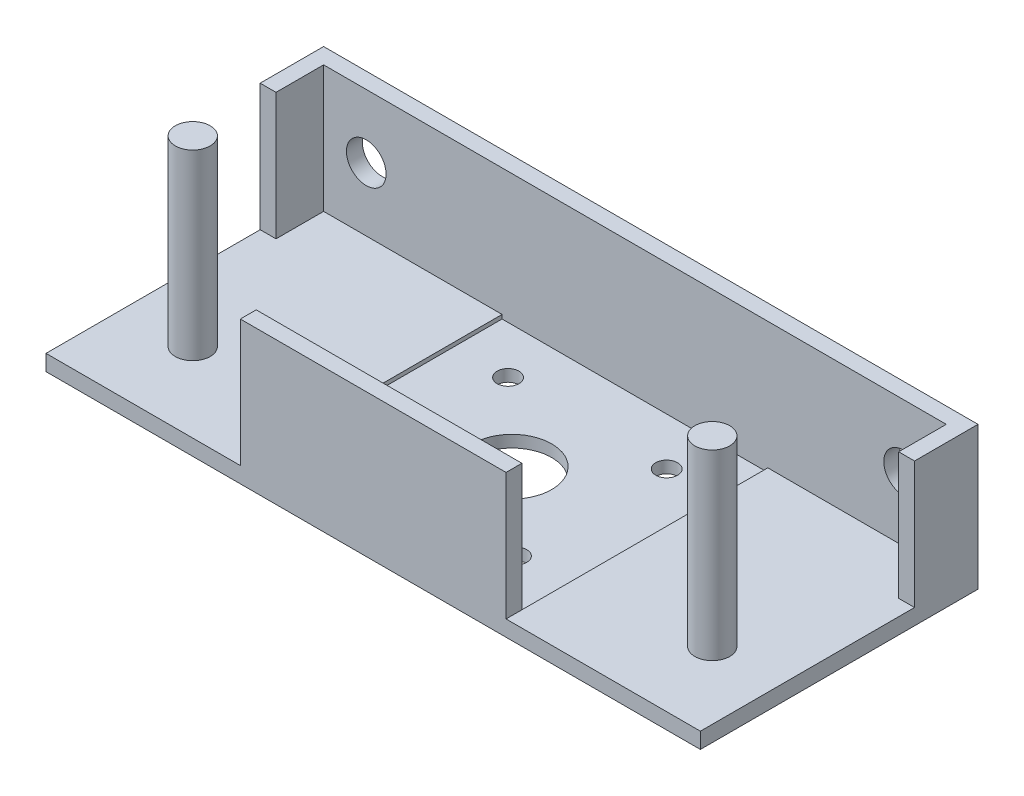
ISO-10303-21;
HEADER;
FILE_DESCRIPTION(('STEP AP214'),'2;1');
FILE_NAME('part.step','',(''),(''),'','','');
FILE_SCHEMA(('AUTOMOTIVE_DESIGN { 1 0 10303 214 1 1 1 1 }'));
ENDSEC;
DATA;
#1=APPLICATION_CONTEXT('core data for automotive mechanical design processes');
#2=APPLICATION_PROTOCOL_DEFINITION('international standard','automotive_design',2000,#1);
#3=PRODUCT_CONTEXT('',#1,'mechanical');
#4=PRODUCT('Part','Part','',(#3));
#5=PRODUCT_RELATED_PRODUCT_CATEGORY('part','',(#4));
#6=PRODUCT_DEFINITION_FORMATION('','',#4);
#7=PRODUCT_DEFINITION_CONTEXT('part definition',#1,'design');
#8=PRODUCT_DEFINITION('design','',#6,#7);
#9=PRODUCT_DEFINITION_SHAPE('','',#8);
#10=(LENGTH_UNIT() NAMED_UNIT(*) SI_UNIT(.MILLI.,.METRE.));
#11=(NAMED_UNIT(*) PLANE_ANGLE_UNIT() SI_UNIT($,.RADIAN.));
#12=(NAMED_UNIT(*) SI_UNIT($,.STERADIAN.) SOLID_ANGLE_UNIT());
#13=UNCERTAINTY_MEASURE_WITH_UNIT(LENGTH_MEASURE(1.E-05),#10,'distance_accuracy_value','');
#14=(GEOMETRIC_REPRESENTATION_CONTEXT(3) GLOBAL_UNCERTAINTY_ASSIGNED_CONTEXT((#13)) GLOBAL_UNIT_ASSIGNED_CONTEXT((#10,
#11,#12)) REPRESENTATION_CONTEXT('',''));
#15=CARTESIAN_POINT('',(0.,0.,0.));
#16=DIRECTION('',(0.,0.,1.));
#17=DIRECTION('',(1.,0.,0.));
#18=AXIS2_PLACEMENT_3D('',#15,#16,#17);
#19=CARTESIAN_POINT('',(-33.5,113.,31.));
#20=DIRECTION('',(0.,0.,-1.));
#21=DIRECTION('',(-1.,0.,0.));
#22=AXIS2_PLACEMENT_3D('',#19,#20,#21);
#23=PLANE('',#22);
#24=DIRECTION('',(0.,-1.,0.));
#25=VECTOR('',#24,1.);
#26=CARTESIAN_POINT('',(-33.5,113.,31.));
#27=LINE('',#26,#25);
#28=CARTESIAN_POINT('',(-33.5,84.,31.));
#29=VERTEX_POINT('',#28);
#30=CARTESIAN_POINT('',(-33.5,83.,31.));
#31=VERTEX_POINT('',#30);
#32=EDGE_CURVE('E214',#29,#31,#27,.T.);
#33=ORIENTED_EDGE('',*,*,#32,.F.);
#34=DIRECTION('',(0.,1.,0.));
#35=VECTOR('',#34,1.);
#36=CARTESIAN_POINT('',(-33.5,113.,31.));
#37=LINE('',#36,#35);
#38=CARTESIAN_POINT('',(-33.5,116.,31.));
#39=VERTEX_POINT('',#38);
#40=EDGE_CURVE('E357',#29,#39,#37,.T.);
#41=ORIENTED_EDGE('',*,*,#40,.T.);
#42=DIRECTION('',(1.,0.,0.));
#43=VECTOR('',#42,1.);
#44=CARTESIAN_POINT('',(-78.5,116.,31.));
#45=LINE('',#44,#43);
#46=CARTESIAN_POINT('',(33.5,116.,31.));
#47=VERTEX_POINT('',#46);
#48=EDGE_CURVE('E241',#39,#47,#45,.T.);
#49=ORIENTED_EDGE('',*,*,#48,.T.);
#50=DIRECTION('',(0.,1.,0.));
#51=VECTOR('',#50,1.);
#52=CARTESIAN_POINT('',(33.5,113.,31.));
#53=LINE('',#52,#51);
#54=CARTESIAN_POINT('',(33.5,84.,31.));
#55=VERTEX_POINT('',#54);
#56=EDGE_CURVE('E349',#55,#47,#53,.T.);
#57=ORIENTED_EDGE('',*,*,#56,.F.);
#58=DIRECTION('',(0.,-1.,0.));
#59=VECTOR('',#58,1.);
#60=CARTESIAN_POINT('',(33.5,113.,31.));
#61=LINE('',#60,#59);
#62=CARTESIAN_POINT('',(33.5,83.,31.));
#63=VERTEX_POINT('',#62);
#64=EDGE_CURVE('E210',#55,#63,#61,.T.);
#65=ORIENTED_EDGE('',*,*,#64,.T.);
#66=DIRECTION('',(-1.,0.,0.));
#67=VECTOR('',#66,1.);
#68=CARTESIAN_POINT('',(-33.5,83.,31.));
#69=LINE('',#68,#67);
#70=EDGE_CURVE('E412',#63,#31,#69,.T.);
#71=ORIENTED_EDGE('',*,*,#70,.T.);
#72=EDGE_LOOP('',(#33,#41,#49,#57,#65,#71));
#73=FACE_BOUND('',#72,.T.);
#74=ADVANCED_FACE('F47',(#73),#23,.T.);
#75=CARTESIAN_POINT('',(-82.5,0.,0.));
#76=DIRECTION('',(-1.,0.,0.));
#77=DIRECTION('',(0.,0.,1.));
#78=AXIS2_PLACEMENT_3D('',#75,#76,#77);
#79=PLANE('',#78);
#80=DIRECTION('',(0.,1.,0.));
#81=VECTOR('',#80,1.);
#82=CARTESIAN_POINT('',(-82.5,113.,35.));
#83=LINE('',#82,#81);
#84=CARTESIAN_POINT('',(-82.5,80.,35.));
#85=VERTEX_POINT('',#84);
#86=CARTESIAN_POINT('',(-82.5,84.,35.));
#87=VERTEX_POINT('',#86);
#88=EDGE_CURVE('E187',#85,#87,#83,.T.);
#89=ORIENTED_EDGE('',*,*,#88,.T.);
#90=DIRECTION('',(0.,0.,1.));
#91=VECTOR('',#90,1.);
#92=CARTESIAN_POINT('',(-82.5,84.,-19.));
#93=LINE('',#92,#91);
#94=CARTESIAN_POINT('',(-82.5,84.,-19.));
#95=VERTEX_POINT('',#94);
#96=EDGE_CURVE('E169',#95,#87,#93,.T.);
#97=ORIENTED_EDGE('',*,*,#96,.F.);
#98=DIRECTION('',(0.,-1.,0.));
#99=VECTOR('',#98,1.);
#100=CARTESIAN_POINT('',(-82.5,84.,-19.));
#101=LINE('',#100,#99);
#102=CARTESIAN_POINT('',(-82.5,116.,-19.));
#103=VERTEX_POINT('',#102);
#104=EDGE_CURVE('E181',#103,#95,#101,.T.);
#105=ORIENTED_EDGE('',*,*,#104,.F.);
#106=DIRECTION('',(0.,0.,1.));
#107=VECTOR('',#106,1.);
#108=CARTESIAN_POINT('',(-82.5,116.,-35.));
#109=LINE('',#108,#107);
#110=CARTESIAN_POINT('',(-82.5,116.,-35.));
#111=VERTEX_POINT('',#110);
#112=EDGE_CURVE('E234',#111,#103,#109,.T.);
#113=ORIENTED_EDGE('',*,*,#112,.F.);
#114=DIRECTION('',(0.,-1.,0.));
#115=VECTOR('',#114,1.);
#116=CARTESIAN_POINT('',(-82.5,113.,-35.));
#117=LINE('',#116,#115);
#118=CARTESIAN_POINT('',(-82.5,80.,-35.));
#119=VERTEX_POINT('',#118);
#120=EDGE_CURVE('E199',#111,#119,#117,.T.);
#121=ORIENTED_EDGE('',*,*,#120,.T.);
#122=DIRECTION('',(0.,0.,1.));
#123=VECTOR('',#122,1.);
#124=CARTESIAN_POINT('',(-82.5,80.,-35.));
#125=LINE('',#124,#123);
#126=EDGE_CURVE('E196',#119,#85,#125,.T.);
#127=ORIENTED_EDGE('',*,*,#126,.T.);
#128=EDGE_LOOP('',(#89,#97,#105,#113,#121,#127));
#129=FACE_BOUND('',#128,.T.);
#130=ADVANCED_FACE('F194',(#129),#79,.T.);
#131=CARTESIAN_POINT('',(0.,116.,0.));
#132=DIRECTION('',(0.,1.,0.));
#133=DIRECTION('',(0.,0.,1.));
#134=AXIS2_PLACEMENT_3D('',#131,#132,#133);
#135=PLANE('',#134);
#136=ORIENTED_EDGE('',*,*,#48,.F.);
#137=DIRECTION('',(0.,0.,1.));
#138=VECTOR('',#137,1.);
#139=CARTESIAN_POINT('',(-33.5,116.,35.));
#140=LINE('',#139,#138);
#141=CARTESIAN_POINT('',(-33.5,116.,35.));
#142=VERTEX_POINT('',#141);
#143=EDGE_CURVE('E191',#39,#142,#140,.T.);
#144=ORIENTED_EDGE('',*,*,#143,.T.);
#145=DIRECTION('',(1.,0.,0.));
#146=VECTOR('',#145,1.);
#147=CARTESIAN_POINT('',(-82.5,116.,35.));
#148=LINE('',#147,#146);
#149=CARTESIAN_POINT('',(33.5,116.,35.));
#150=VERTEX_POINT('',#149);
#151=EDGE_CURVE('E260',#142,#150,#148,.T.);
#152=ORIENTED_EDGE('',*,*,#151,.T.);
#153=DIRECTION('',(0.,0.,1.));
#154=VECTOR('',#153,1.);
#155=CARTESIAN_POINT('',(33.5,116.,35.));
#156=LINE('',#155,#154);
#157=EDGE_CURVE('E351',#47,#150,#156,.T.);
#158=ORIENTED_EDGE('',*,*,#157,.F.);
#159=EDGE_LOOP('',(#136,#144,#152,#158));
#160=FACE_BOUND('',#159,.T.);
#161=ADVANCED_FACE('F452',(#160),#135,.T.);
#162=CARTESIAN_POINT('',(0.,0.,35.));
#163=DIRECTION('',(0.,0.,1.));
#164=DIRECTION('',(1.,0.,0.));
#165=AXIS2_PLACEMENT_3D('',#162,#163,#164);
#166=PLANE('',#165);
#167=ORIENTED_EDGE('',*,*,#151,.F.);
#168=DIRECTION('',(0.,1.,0.));
#169=VECTOR('',#168,1.);
#170=CARTESIAN_POINT('',(-33.5,84.,35.));
#171=LINE('',#170,#169);
#172=CARTESIAN_POINT('',(-33.5,84.,35.));
#173=VERTEX_POINT('',#172);
#174=EDGE_CURVE('E188',#173,#142,#171,.T.);
#175=ORIENTED_EDGE('',*,*,#174,.F.);
#176=DIRECTION('',(-1.,0.,0.));
#177=VECTOR('',#176,1.);
#178=CARTESIAN_POINT('',(-82.5,84.,35.));
#179=LINE('',#178,#177);
#180=EDGE_CURVE('E173',#173,#87,#179,.T.);
#181=ORIENTED_EDGE('',*,*,#180,.T.);
#182=ORIENTED_EDGE('',*,*,#88,.F.);
#183=DIRECTION('',(-1.,0.,0.));
#184=VECTOR('',#183,1.);
#185=CARTESIAN_POINT('',(-82.5,80.,35.));
#186=LINE('',#185,#184);
#187=CARTESIAN_POINT('',(82.5,80.,35.));
#188=VERTEX_POINT('',#187);
#189=EDGE_CURVE('E290',#188,#85,#186,.T.);
#190=ORIENTED_EDGE('',*,*,#189,.F.);
#191=DIRECTION('',(0.,1.,0.));
#192=VECTOR('',#191,1.);
#193=CARTESIAN_POINT('',(82.5,113.,35.));
#194=LINE('',#193,#192);
#195=CARTESIAN_POINT('',(82.5,84.,35.));
#196=VERTEX_POINT('',#195);
#197=EDGE_CURVE('E206',#188,#196,#194,.T.);
#198=ORIENTED_EDGE('',*,*,#197,.T.);
#199=DIRECTION('',(1.,0.,0.));
#200=VECTOR('',#199,1.);
#201=CARTESIAN_POINT('',(82.5,84.,35.));
#202=LINE('',#201,#200);
#203=CARTESIAN_POINT('',(33.5,84.,35.));
#204=VERTEX_POINT('',#203);
#205=EDGE_CURVE('E332',#204,#196,#202,.T.);
#206=ORIENTED_EDGE('',*,*,#205,.F.);
#207=DIRECTION('',(0.,1.,0.));
#208=VECTOR('',#207,1.);
#209=CARTESIAN_POINT('',(33.5,84.,35.));
#210=LINE('',#209,#208);
#211=EDGE_CURVE('E345',#204,#150,#210,.T.);
#212=ORIENTED_EDGE('',*,*,#211,.T.);
#213=EDGE_LOOP('',(#167,#175,#181,#182,#190,#198,#206,#212));
#214=FACE_BOUND('',#213,.T.);
#215=ADVANCED_FACE('F186',(#214),#166,.T.);
#216=CARTESIAN_POINT('',(82.5,0.,0.));
#217=DIRECTION('',(1.,0.,0.));
#218=DIRECTION('',(0.,0.,1.));
#219=AXIS2_PLACEMENT_3D('',#216,#217,#218);
#220=PLANE('',#219);
#221=DIRECTION('',(0.,0.,1.));
#222=VECTOR('',#221,1.);
#223=CARTESIAN_POINT('',(82.5,84.,-19.));
#224=LINE('',#223,#222);
#225=CARTESIAN_POINT('',(82.5,84.,-19.));
#226=VERTEX_POINT('',#225);
#227=EDGE_CURVE('E272',#226,#196,#224,.T.);
#228=ORIENTED_EDGE('',*,*,#227,.T.);
#229=ORIENTED_EDGE('',*,*,#197,.F.);
#230=DIRECTION('',(0.,0.,1.));
#231=VECTOR('',#230,1.);
#232=CARTESIAN_POINT('',(82.5,80.,-35.));
#233=LINE('',#232,#231);
#234=CARTESIAN_POINT('',(82.5,80.,-35.));
#235=VERTEX_POINT('',#234);
#236=EDGE_CURVE('E285',#235,#188,#233,.T.);
#237=ORIENTED_EDGE('',*,*,#236,.F.);
#238=DIRECTION('',(0.,-1.,0.));
#239=VECTOR('',#238,1.);
#240=CARTESIAN_POINT('',(82.5,113.,-35.));
#241=LINE('',#240,#239);
#242=CARTESIAN_POINT('',(82.5,116.,-35.));
#243=VERTEX_POINT('',#242);
#244=EDGE_CURVE('E312',#243,#235,#241,.T.);
#245=ORIENTED_EDGE('',*,*,#244,.F.);
#246=DIRECTION('',(0.,0.,-1.));
#247=VECTOR('',#246,1.);
#248=CARTESIAN_POINT('',(82.5,116.,-35.));
#249=LINE('',#248,#247);
#250=CARTESIAN_POINT('',(82.5,116.,-19.));
#251=VERTEX_POINT('',#250);
#252=EDGE_CURVE('E263',#251,#243,#249,.T.);
#253=ORIENTED_EDGE('',*,*,#252,.F.);
#254=DIRECTION('',(0.,-1.,0.));
#255=VECTOR('',#254,1.);
#256=CARTESIAN_POINT('',(82.5,84.,-19.));
#257=LINE('',#256,#255);
#258=EDGE_CURVE('E180',#251,#226,#257,.T.);
#259=ORIENTED_EDGE('',*,*,#258,.T.);
#260=EDGE_LOOP('',(#228,#229,#237,#245,#253,#259));
#261=FACE_BOUND('',#260,.T.);
#262=ADVANCED_FACE('F335',(#261),#220,.T.);
#263=CARTESIAN_POINT('',(0.,83.,0.));
#264=DIRECTION('',(0.,-1.,0.));
#265=DIRECTION('',(0.,0.,-1.));
#266=AXIS2_PLACEMENT_3D('',#263,#264,#265);
#267=PLANE('',#266);
#268=CARTESIAN_POINT('',(20.,83.,-19.));
#269=DIRECTION('',(0.,1.,0.));
#270=DIRECTION('',(0.,0.,-1.));
#271=AXIS2_PLACEMENT_3D('',#268,#269,#270);
#272=CIRCLE('',#271,2.75);
#273=CARTESIAN_POINT('',(20.,83.,-21.75));
#274=VERTEX_POINT('',#273);
#275=EDGE_CURVE('E388',#274,#274,#272,.T.);
#276=ORIENTED_EDGE('',*,*,#275,.F.);
#277=EDGE_LOOP('',(#276));
#278=FACE_BOUND('',#277,.T.);
#279=CARTESIAN_POINT('',(20.,83.,19.));
#280=DIRECTION('',(0.,1.,0.));
#281=DIRECTION('',(0.,0.,-1.));
#282=AXIS2_PLACEMENT_3D('',#279,#280,#281);
#283=CIRCLE('',#282,2.75);
#284=CARTESIAN_POINT('',(20.,83.,16.25));
#285=VERTEX_POINT('',#284);
#286=EDGE_CURVE('E380',#285,#285,#283,.T.);
#287=ORIENTED_EDGE('',*,*,#286,.F.);
#288=EDGE_LOOP('',(#287));
#289=FACE_BOUND('',#288,.T.);
#290=CARTESIAN_POINT('',(-20.,83.,-19.));
#291=DIRECTION('',(0.,1.,0.));
#292=DIRECTION('',(0.,0.,1.));
#293=AXIS2_PLACEMENT_3D('',#290,#291,#292);
#294=CIRCLE('',#293,2.75);
#295=CARTESIAN_POINT('',(-20.,83.,-16.25));
#296=VERTEX_POINT('',#295);
#297=EDGE_CURVE('E372',#296,#296,#294,.T.);
#298=ORIENTED_EDGE('',*,*,#297,.F.);
#299=EDGE_LOOP('',(#298));
#300=FACE_BOUND('',#299,.T.);
#301=CARTESIAN_POINT('',(-20.,83.,19.));
#302=DIRECTION('',(0.,1.,0.));
#303=DIRECTION('',(0.,0.,1.));
#304=AXIS2_PLACEMENT_3D('',#301,#302,#303);
#305=CIRCLE('',#304,2.75);
#306=CARTESIAN_POINT('',(-20.,83.,21.75));
#307=VERTEX_POINT('',#306);
#308=EDGE_CURVE('E363',#307,#307,#305,.T.);
#309=ORIENTED_EDGE('',*,*,#308,.F.);
#310=EDGE_LOOP('',(#309));
#311=FACE_BOUND('',#310,.T.);
#312=DIRECTION('',(0.,0.,-1.));
#313=VECTOR('',#312,1.);
#314=CARTESIAN_POINT('',(-33.5,83.,31.));
#315=LINE('',#314,#313);
#316=CARTESIAN_POINT('',(-33.5,83.,-31.));
#317=VERTEX_POINT('',#316);
#318=EDGE_CURVE('E63',#31,#317,#315,.T.);
#319=ORIENTED_EDGE('',*,*,#318,.F.);
#320=ORIENTED_EDGE('',*,*,#70,.F.);
#321=DIRECTION('',(0.,0.,1.));
#322=VECTOR('',#321,1.);
#323=CARTESIAN_POINT('',(33.5,83.,31.));
#324=LINE('',#323,#322);
#325=CARTESIAN_POINT('',(33.5,83.,-31.));
#326=VERTEX_POINT('',#325);
#327=EDGE_CURVE('E408',#326,#63,#324,.T.);
#328=ORIENTED_EDGE('',*,*,#327,.F.);
#329=DIRECTION('',(1.,0.,0.));
#330=VECTOR('',#329,1.);
#331=CARTESIAN_POINT('',(-33.5,83.,-31.));
#332=LINE('',#331,#330);
#333=EDGE_CURVE('E404',#317,#326,#332,.T.);
#334=ORIENTED_EDGE('',*,*,#333,.F.);
#335=EDGE_LOOP('',(#319,#320,#328,#334));
#336=FACE_BOUND('',#335,.T.);
#337=CARTESIAN_POINT('',(0.,83.,0.));
#338=DIRECTION('',(0.,1.,0.));
#339=DIRECTION('',(0.,0.,1.));
#340=AXIS2_PLACEMENT_3D('',#337,#338,#339);
#341=CIRCLE('',#340,10.);
#342=CARTESIAN_POINT('',(0.,83.,10.));
#343=VERTEX_POINT('',#342);
#344=EDGE_CURVE('E367',#343,#343,#341,.T.);
#345=ORIENTED_EDGE('',*,*,#344,.F.);
#346=EDGE_LOOP('',(#345));
#347=FACE_BOUND('',#346,.T.);
#348=ADVANCED_FACE('F473',(#278,#289,#300,#311,#336,#347),#267,.F.);
#349=CARTESIAN_POINT('',(-33.5,0.,-14.));
#350=DIRECTION('',(-1.,0.,0.));
#351=DIRECTION('',(0.,0.,1.));
#352=AXIS2_PLACEMENT_3D('',#349,#350,#351);
#353=PLANE('',#352);
#354=ORIENTED_EDGE('',*,*,#318,.T.);
#355=DIRECTION('',(0.,-1.,0.));
#356=VECTOR('',#355,1.);
#357=CARTESIAN_POINT('',(-33.5,113.,-31.));
#358=LINE('',#357,#356);
#359=CARTESIAN_POINT('',(-33.5,84.,-31.));
#360=VERTEX_POINT('',#359);
#361=EDGE_CURVE('E204',#360,#317,#358,.T.);
#362=ORIENTED_EDGE('',*,*,#361,.F.);
#363=DIRECTION('',(0.,0.,-1.));
#364=VECTOR('',#363,1.);
#365=CARTESIAN_POINT('',(-33.5,84.,-31.));
#366=LINE('',#365,#364);
#367=EDGE_CURVE('E299',#29,#360,#366,.T.);
#368=ORIENTED_EDGE('',*,*,#367,.F.);
#369=ORIENTED_EDGE('',*,*,#32,.T.);
#370=EDGE_LOOP('',(#354,#362,#368,#369));
#371=FACE_BOUND('',#370,.T.);
#372=ADVANCED_FACE('F49',(#371),#353,.F.);
#373=CARTESIAN_POINT('',(33.5,0.,-14.));
#374=DIRECTION('',(1.,0.,0.));
#375=DIRECTION('',(0.,0.,-1.));
#376=AXIS2_PLACEMENT_3D('',#373,#374,#375);
#377=PLANE('',#376);
#378=ORIENTED_EDGE('',*,*,#327,.T.);
#379=ORIENTED_EDGE('',*,*,#64,.F.);
#380=DIRECTION('',(0.,0.,1.));
#381=VECTOR('',#380,1.);
#382=CARTESIAN_POINT('',(33.5,84.,31.));
#383=LINE('',#382,#381);
#384=CARTESIAN_POINT('',(33.5,84.,-31.));
#385=VERTEX_POINT('',#384);
#386=EDGE_CURVE('E303',#385,#55,#383,.T.);
#387=ORIENTED_EDGE('',*,*,#386,.F.);
#388=DIRECTION('',(0.,-1.,0.));
#389=VECTOR('',#388,1.);
#390=CARTESIAN_POINT('',(33.5,113.,-31.));
#391=LINE('',#390,#389);
#392=EDGE_CURVE('E198',#385,#326,#391,.T.);
#393=ORIENTED_EDGE('',*,*,#392,.T.);
#394=EDGE_LOOP('',(#378,#379,#387,#393));
#395=FACE_BOUND('',#394,.T.);
#396=ADVANCED_FACE('F460',(#395),#377,.F.);
#397=CARTESIAN_POINT('',(33.5,113.,-31.));
#398=DIRECTION('',(0.,0.,1.));
#399=DIRECTION('',(1.,0.,0.));
#400=AXIS2_PLACEMENT_3D('',#397,#398,#399);
#401=PLANE('',#400);
#402=CARTESIAN_POINT('',(-67.75,100.,-31.));
#403=DIRECTION('',(0.,0.,1.));
#404=DIRECTION('',(1.,0.,0.));
#405=AXIS2_PLACEMENT_3D('',#402,#403,#404);
#406=CIRCLE('',#405,5.00000000000001);
#407=CARTESIAN_POINT('',(-62.75,100.,-31.));
#408=VERTEX_POINT('',#407);
#409=EDGE_CURVE('E419',#408,#408,#406,.F.);
#410=ORIENTED_EDGE('',*,*,#409,.T.);
#411=EDGE_LOOP('',(#410));
#412=FACE_BOUND('',#411,.T.);
#413=CARTESIAN_POINT('',(67.75,100.,-31.));
#414=DIRECTION('',(0.,0.,1.));
#415=DIRECTION('',(1.,0.,0.));
#416=AXIS2_PLACEMENT_3D('',#413,#414,#415);
#417=CIRCLE('',#416,5.00000000000001);
#418=CARTESIAN_POINT('',(72.75,100.,-31.));
#419=VERTEX_POINT('',#418);
#420=EDGE_CURVE('E242',#419,#419,#417,.T.);
#421=ORIENTED_EDGE('',*,*,#420,.F.);
#422=EDGE_LOOP('',(#421));
#423=FACE_BOUND('',#422,.T.);
#424=ORIENTED_EDGE('',*,*,#361,.T.);
#425=ORIENTED_EDGE('',*,*,#333,.T.);
#426=ORIENTED_EDGE('',*,*,#392,.F.);
#427=DIRECTION('',(-1.,0.,0.));
#428=VECTOR('',#427,1.);
#429=CARTESIAN_POINT('',(33.5,84.,-31.));
#430=LINE('',#429,#428);
#431=CARTESIAN_POINT('',(78.5,84.,-31.));
#432=VERTEX_POINT('',#431);
#433=EDGE_CURVE('E316',#432,#385,#430,.T.);
#434=ORIENTED_EDGE('',*,*,#433,.F.);
#435=DIRECTION('',(0.,1.,0.));
#436=VECTOR('',#435,1.);
#437=CARTESIAN_POINT('',(78.5,84.,-31.));
#438=LINE('',#437,#436);
#439=CARTESIAN_POINT('',(78.5,116.,-31.));
#440=VERTEX_POINT('',#439);
#441=EDGE_CURVE('E295',#432,#440,#438,.T.);
#442=ORIENTED_EDGE('',*,*,#441,.T.);
#443=DIRECTION('',(-1.,0.,0.));
#444=VECTOR('',#443,1.);
#445=CARTESIAN_POINT('',(-78.5,116.,-31.));
#446=LINE('',#445,#444);
#447=CARTESIAN_POINT('',(-78.5,116.,-31.));
#448=VERTEX_POINT('',#447);
#449=EDGE_CURVE('E255',#440,#448,#446,.T.);
#450=ORIENTED_EDGE('',*,*,#449,.T.);
#451=DIRECTION('',(0.,1.,0.));
#452=VECTOR('',#451,1.);
#453=CARTESIAN_POINT('',(-78.5,84.,-31.));
#454=LINE('',#453,#452);
#455=CARTESIAN_POINT('',(-78.5,84.,-31.));
#456=VERTEX_POINT('',#455);
#457=EDGE_CURVE('E238',#456,#448,#454,.T.);
#458=ORIENTED_EDGE('',*,*,#457,.F.);
#459=DIRECTION('',(-1.,0.,0.));
#460=VECTOR('',#459,1.);
#461=CARTESIAN_POINT('',(-33.5,84.,-31.));
#462=LINE('',#461,#460);
#463=EDGE_CURVE('E302',#360,#456,#462,.T.);
#464=ORIENTED_EDGE('',*,*,#463,.F.);
#465=EDGE_LOOP('',(#424,#425,#426,#434,#442,#450,#458,#464));
#466=FACE_BOUND('',#465,.T.);
#467=ADVANCED_FACE('F457',(#412,#423,#466),#401,.T.);
#468=CARTESIAN_POINT('',(-78.5,84.,-31.));
#469=DIRECTION('',(-1.,0.,0.));
#470=DIRECTION('',(0.,0.,1.));
#471=AXIS2_PLACEMENT_3D('',#468,#469,#470);
#472=PLANE('',#471);
#473=DIRECTION('',(0.,0.,1.));
#474=VECTOR('',#473,1.);
#475=CARTESIAN_POINT('',(-78.5,116.,-31.));
#476=LINE('',#475,#474);
#477=CARTESIAN_POINT('',(-78.5,116.,-19.));
#478=VERTEX_POINT('',#477);
#479=EDGE_CURVE('E231',#448,#478,#476,.T.);
#480=ORIENTED_EDGE('',*,*,#479,.T.);
#481=DIRECTION('',(0.,-1.,0.));
#482=VECTOR('',#481,1.);
#483=CARTESIAN_POINT('',(-78.5,84.,-19.));
#484=LINE('',#483,#482);
#485=CARTESIAN_POINT('',(-78.5,84.,-19.));
#486=VERTEX_POINT('',#485);
#487=EDGE_CURVE('E71',#478,#486,#484,.T.);
#488=ORIENTED_EDGE('',*,*,#487,.T.);
#489=DIRECTION('',(0.,0.,1.));
#490=VECTOR('',#489,1.);
#491=CARTESIAN_POINT('',(-78.5,84.,-31.));
#492=LINE('',#491,#490);
#493=EDGE_CURVE('E307',#456,#486,#492,.T.);
#494=ORIENTED_EDGE('',*,*,#493,.F.);
#495=ORIENTED_EDGE('',*,*,#457,.T.);
#496=EDGE_LOOP('',(#480,#488,#494,#495));
#497=FACE_BOUND('',#496,.T.);
#498=ADVANCED_FACE('F236',(#497),#472,.F.);
#499=ORIENTED_EDGE('',*,*,#112,.T.);
#500=DIRECTION('',(1.,0.,0.));
#501=VECTOR('',#500,1.);
#502=CARTESIAN_POINT('',(0.,116.,-19.));
#503=LINE('',#502,#501);
#504=EDGE_CURVE('E56',#103,#478,#503,.T.);
#505=ORIENTED_EDGE('',*,*,#504,.T.);
#506=ORIENTED_EDGE('',*,*,#479,.F.);
#507=ORIENTED_EDGE('',*,*,#449,.F.);
#508=DIRECTION('',(0.,0.,-1.));
#509=VECTOR('',#508,1.);
#510=CARTESIAN_POINT('',(78.5,116.,-31.));
#511=LINE('',#510,#509);
#512=CARTESIAN_POINT('',(78.5,116.,-19.));
#513=VERTEX_POINT('',#512);
#514=EDGE_CURVE('E246',#513,#440,#511,.T.);
#515=ORIENTED_EDGE('',*,*,#514,.F.);
#516=DIRECTION('',(-1.,0.,0.));
#517=VECTOR('',#516,1.);
#518=CARTESIAN_POINT('',(0.,116.,-19.));
#519=LINE('',#518,#517);
#520=EDGE_CURVE('E217',#251,#513,#519,.T.);
#521=ORIENTED_EDGE('',*,*,#520,.F.);
#522=ORIENTED_EDGE('',*,*,#252,.T.);
#523=DIRECTION('',(-1.,0.,0.));
#524=VECTOR('',#523,1.);
#525=CARTESIAN_POINT('',(-82.5,116.,-35.));
#526=LINE('',#525,#524);
#527=EDGE_CURVE('E266',#243,#111,#526,.T.);
#528=ORIENTED_EDGE('',*,*,#527,.T.);
#529=EDGE_LOOP('',(#499,#505,#506,#507,#515,#521,#522,#528));
#530=FACE_BOUND('',#529,.T.);
#531=ADVANCED_FACE('F229',(#530),#135,.T.);
#532=CARTESIAN_POINT('',(0.,84.,0.));
#533=DIRECTION('',(0.,-1.,0.));
#534=DIRECTION('',(0.,0.,-1.));
#535=AXIS2_PLACEMENT_3D('',#532,#533,#534);
#536=PLANE('',#535);
#537=CARTESIAN_POINT('',(65.5,84.,15.));
#538=DIRECTION('',(0.,-1.,0.));
#539=DIRECTION('',(0.,0.,-1.));
#540=AXIS2_PLACEMENT_3D('',#537,#538,#539);
#541=CIRCLE('',#540,4.4);
#542=CARTESIAN_POINT('',(65.5,84.,10.6));
#543=VERTEX_POINT('',#542);
#544=EDGE_CURVE('E11',#543,#543,#541,.F.);
#545=ORIENTED_EDGE('',*,*,#544,.F.);
#546=EDGE_LOOP('',(#545));
#547=FACE_BOUND('',#546,.T.);
#548=ORIENTED_EDGE('',*,*,#386,.T.);
#549=DIRECTION('',(0.,0.,1.));
#550=VECTOR('',#549,1.);
#551=CARTESIAN_POINT('',(33.5,84.,35.));
#552=LINE('',#551,#550);
#553=EDGE_CURVE('E342',#55,#204,#552,.T.);
#554=ORIENTED_EDGE('',*,*,#553,.T.);
#555=ORIENTED_EDGE('',*,*,#205,.T.);
#556=ORIENTED_EDGE('',*,*,#227,.F.);
#557=DIRECTION('',(-1.,0.,0.));
#558=VECTOR('',#557,1.);
#559=CARTESIAN_POINT('',(82.5,84.,-19.));
#560=LINE('',#559,#558);
#561=CARTESIAN_POINT('',(78.5,84.,-19.));
#562=VERTEX_POINT('',#561);
#563=EDGE_CURVE('E277',#226,#562,#560,.T.);
#564=ORIENTED_EDGE('',*,*,#563,.T.);
#565=DIRECTION('',(0.,0.,-1.));
#566=VECTOR('',#565,1.);
#567=CARTESIAN_POINT('',(78.5,84.,31.));
#568=LINE('',#567,#566);
#569=EDGE_CURVE('E319',#562,#432,#568,.T.);
#570=ORIENTED_EDGE('',*,*,#569,.T.);
#571=ORIENTED_EDGE('',*,*,#433,.T.);
#572=EDGE_LOOP('',(#548,#554,#555,#556,#564,#570,#571));
#573=FACE_BOUND('',#572,.T.);
#574=ADVANCED_FACE('F340',(#547,#573),#536,.F.);
#575=CARTESIAN_POINT('',(0.,0.,-35.));
#576=DIRECTION('',(0.,0.,-1.));
#577=DIRECTION('',(-1.,0.,0.));
#578=AXIS2_PLACEMENT_3D('',#575,#576,#577);
#579=PLANE('',#578);
#580=ORIENTED_EDGE('',*,*,#244,.T.);
#581=DIRECTION('',(-1.,0.,0.));
#582=VECTOR('',#581,1.);
#583=CARTESIAN_POINT('',(-82.5,80.,-35.));
#584=LINE('',#583,#582);
#585=EDGE_CURVE('E286',#235,#119,#584,.T.);
#586=ORIENTED_EDGE('',*,*,#585,.T.);
#587=ORIENTED_EDGE('',*,*,#120,.F.);
#588=ORIENTED_EDGE('',*,*,#527,.F.);
#589=EDGE_LOOP('',(#580,#586,#587,#588));
#590=FACE_BOUND('',#589,.T.);
#591=CARTESIAN_POINT('',(-67.75,100.,-35.));
#592=DIRECTION('',(0.,0.,-1.));
#593=DIRECTION('',(-1.,0.,0.));
#594=AXIS2_PLACEMENT_3D('',#591,#592,#593);
#595=CIRCLE('',#594,5.00000000000001);
#596=CARTESIAN_POINT('',(-72.75,100.,-35.));
#597=VERTEX_POINT('',#596);
#598=EDGE_CURVE('E415',#597,#597,#595,.T.);
#599=ORIENTED_EDGE('',*,*,#598,.F.);
#600=EDGE_LOOP('',(#599));
#601=FACE_BOUND('',#600,.T.);
#602=CARTESIAN_POINT('',(67.75,100.,-35.));
#603=DIRECTION('',(0.,0.,1.));
#604=DIRECTION('',(1.,0.,0.));
#605=AXIS2_PLACEMENT_3D('',#602,#603,#604);
#606=CIRCLE('',#605,5.00000000000001);
#607=CARTESIAN_POINT('',(72.75,100.,-35.));
#608=VERTEX_POINT('',#607);
#609=EDGE_CURVE('E249',#608,#608,#606,.T.);
#610=ORIENTED_EDGE('',*,*,#609,.T.);
#611=EDGE_LOOP('',(#610));
#612=FACE_BOUND('',#611,.T.);
#613=ADVANCED_FACE('F426',(#590,#601,#612),#579,.T.);
#614=CARTESIAN_POINT('',(78.5,84.,31.));
#615=DIRECTION('',(1.,0.,0.));
#616=DIRECTION('',(0.,0.,-1.));
#617=AXIS2_PLACEMENT_3D('',#614,#615,#616);
#618=PLANE('',#617);
#619=DIRECTION('',(0.,1.,0.));
#620=VECTOR('',#619,1.);
#621=CARTESIAN_POINT('',(78.5,84.,-19.));
#622=LINE('',#621,#620);
#623=EDGE_CURVE('E282',#562,#513,#622,.T.);
#624=ORIENTED_EDGE('',*,*,#623,.T.);
#625=ORIENTED_EDGE('',*,*,#514,.T.);
#626=ORIENTED_EDGE('',*,*,#441,.F.);
#627=ORIENTED_EDGE('',*,*,#569,.F.);
#628=EDGE_LOOP('',(#624,#625,#626,#627));
#629=FACE_BOUND('',#628,.T.);
#630=ADVANCED_FACE('F465',(#629),#618,.F.);
#631=CARTESIAN_POINT('',(0.,84.,0.));
#632=DIRECTION('',(0.,-1.,0.));
#633=DIRECTION('',(0.,0.,-1.));
#634=AXIS2_PLACEMENT_3D('',#631,#632,#633);
#635=PLANE('',#634);
#636=CARTESIAN_POINT('',(-65.5,84.,15.));
#637=DIRECTION('',(0.,-1.,0.));
#638=DIRECTION('',(0.,0.,1.));
#639=AXIS2_PLACEMENT_3D('',#636,#637,#638);
#640=CIRCLE('',#639,4.4);
#641=CARTESIAN_POINT('',(-65.5,84.,19.4));
#642=VERTEX_POINT('',#641);
#643=EDGE_CURVE('E576',#642,#642,#640,.T.);
#644=ORIENTED_EDGE('',*,*,#643,.T.);
#645=EDGE_LOOP('',(#644));
#646=FACE_BOUND('',#645,.T.);
#647=DIRECTION('',(0.,0.,1.));
#648=VECTOR('',#647,1.);
#649=CARTESIAN_POINT('',(-33.5,84.,35.));
#650=LINE('',#649,#648);
#651=EDGE_CURVE('E190',#29,#173,#650,.T.);
#652=ORIENTED_EDGE('',*,*,#651,.F.);
#653=ORIENTED_EDGE('',*,*,#367,.T.);
#654=ORIENTED_EDGE('',*,*,#463,.T.);
#655=ORIENTED_EDGE('',*,*,#493,.T.);
#656=EDGE_CURVE('E176',#486,#95,#560,.T.);
#657=ORIENTED_EDGE('',*,*,#656,.T.);
#658=ORIENTED_EDGE('',*,*,#96,.T.);
#659=ORIENTED_EDGE('',*,*,#180,.F.);
#660=EDGE_LOOP('',(#652,#653,#654,#655,#657,#658,#659));
#661=FACE_BOUND('',#660,.T.);
#662=ADVANCED_FACE('F172',(#646,#661),#635,.F.);
#663=CARTESIAN_POINT('',(-82.5,80.,-35.));
#664=DIRECTION('',(0.,1.,0.));
#665=DIRECTION('',(0.,0.,1.));
#666=AXIS2_PLACEMENT_3D('',#663,#664,#665);
#667=PLANE('',#666);
#668=CARTESIAN_POINT('',(20.,80.,-19.));
#669=DIRECTION('',(0.,1.,0.));
#670=DIRECTION('',(0.,0.,-1.));
#671=AXIS2_PLACEMENT_3D('',#668,#669,#670);
#672=CIRCLE('',#671,2.75);
#673=CARTESIAN_POINT('',(20.,80.,-21.75));
#674=VERTEX_POINT('',#673);
#675=EDGE_CURVE('E362',#674,#674,#672,.T.);
#676=ORIENTED_EDGE('',*,*,#675,.T.);
#677=EDGE_LOOP('',(#676));
#678=FACE_BOUND('',#677,.T.);
#679=CARTESIAN_POINT('',(20.,80.,19.));
#680=DIRECTION('',(0.,1.,0.));
#681=DIRECTION('',(0.,0.,-1.));
#682=AXIS2_PLACEMENT_3D('',#679,#680,#681);
#683=CIRCLE('',#682,2.75);
#684=CARTESIAN_POINT('',(20.,80.,16.25));
#685=VERTEX_POINT('',#684);
#686=EDGE_CURVE('E384',#685,#685,#683,.T.);
#687=ORIENTED_EDGE('',*,*,#686,.T.);
#688=EDGE_LOOP('',(#687));
#689=FACE_BOUND('',#688,.T.);
#690=CARTESIAN_POINT('',(-20.,80.,-19.));
#691=DIRECTION('',(0.,1.,0.));
#692=DIRECTION('',(0.,0.,1.));
#693=AXIS2_PLACEMENT_3D('',#690,#691,#692);
#694=CIRCLE('',#693,2.75);
#695=CARTESIAN_POINT('',(-20.,80.,-16.25));
#696=VERTEX_POINT('',#695);
#697=EDGE_CURVE('E376',#696,#696,#694,.T.);
#698=ORIENTED_EDGE('',*,*,#697,.T.);
#699=EDGE_LOOP('',(#698));
#700=FACE_BOUND('',#699,.T.);
#701=CARTESIAN_POINT('',(-20.,80.,19.));
#702=DIRECTION('',(0.,1.,0.));
#703=DIRECTION('',(0.,0.,1.));
#704=AXIS2_PLACEMENT_3D('',#701,#702,#703);
#705=CIRCLE('',#704,2.75);
#706=CARTESIAN_POINT('',(-20.,80.,21.75));
#707=VERTEX_POINT('',#706);
#708=EDGE_CURVE('E368',#707,#707,#705,.T.);
#709=ORIENTED_EDGE('',*,*,#708,.T.);
#710=EDGE_LOOP('',(#709));
#711=FACE_BOUND('',#710,.T.);
#712=CARTESIAN_POINT('',(0.,80.,0.));
#713=DIRECTION('',(0.,1.,0.));
#714=DIRECTION('',(0.,0.,1.));
#715=AXIS2_PLACEMENT_3D('',#712,#713,#714);
#716=CIRCLE('',#715,10.);
#717=CARTESIAN_POINT('',(0.,80.,10.));
#718=VERTEX_POINT('',#717);
#719=EDGE_CURVE('E395',#718,#718,#716,.T.);
#720=ORIENTED_EDGE('',*,*,#719,.T.);
#721=EDGE_LOOP('',(#720));
#722=FACE_BOUND('',#721,.T.);
#723=ORIENTED_EDGE('',*,*,#189,.T.);
#724=ORIENTED_EDGE('',*,*,#126,.F.);
#725=ORIENTED_EDGE('',*,*,#585,.F.);
#726=ORIENTED_EDGE('',*,*,#236,.T.);
#727=EDGE_LOOP('',(#723,#724,#725,#726));
#728=FACE_BOUND('',#727,.T.);
#729=ADVANCED_FACE('F516',(#678,#689,#700,#711,#722,#728),#667,.F.);
#730=CARTESIAN_POINT('',(82.5,84.,-19.));
#731=DIRECTION('',(0.,0.,-1.));
#732=DIRECTION('',(-1.,0.,0.));
#733=AXIS2_PLACEMENT_3D('',#730,#731,#732);
#734=PLANE('',#733);
#735=ORIENTED_EDGE('',*,*,#487,.F.);
#736=ORIENTED_EDGE('',*,*,#504,.F.);
#737=ORIENTED_EDGE('',*,*,#104,.T.);
#738=ORIENTED_EDGE('',*,*,#656,.F.);
#739=EDGE_LOOP('',(#735,#736,#737,#738));
#740=FACE_BOUND('',#739,.T.);
#741=ADVANCED_FACE('F441',(#740),#734,.F.);
#742=ORIENTED_EDGE('',*,*,#563,.F.);
#743=ORIENTED_EDGE('',*,*,#258,.F.);
#744=ORIENTED_EDGE('',*,*,#520,.T.);
#745=ORIENTED_EDGE('',*,*,#623,.F.);
#746=EDGE_LOOP('',(#742,#743,#744,#745));
#747=FACE_BOUND('',#746,.T.);
#748=ADVANCED_FACE('F431',(#747),#734,.F.);
#749=CARTESIAN_POINT('',(67.75,100.,-35.));
#750=DIRECTION('',(0.,0.,1.));
#751=DIRECTION('',(1.,0.,0.));
#752=AXIS2_PLACEMENT_3D('',#749,#750,#751);
#753=CYLINDRICAL_SURFACE('',#752,5.00000000000001);
#754=ORIENTED_EDGE('',*,*,#420,.T.);
#755=EDGE_LOOP('',(#754));
#756=FACE_BOUND('',#755,.T.);
#757=ORIENTED_EDGE('',*,*,#609,.F.);
#758=EDGE_LOOP('',(#757));
#759=FACE_BOUND('',#758,.T.);
#760=ADVANCED_FACE('F428',(#756,#759),#753,.F.);
#761=CARTESIAN_POINT('',(-67.75,100.,-35.));
#762=DIRECTION('',(0.,0.,1.));
#763=DIRECTION('',(1.,0.,0.));
#764=AXIS2_PLACEMENT_3D('',#761,#762,#763);
#765=CYLINDRICAL_SURFACE('',#764,5.00000000000001);
#766=ORIENTED_EDGE('',*,*,#409,.F.);
#767=EDGE_LOOP('',(#766));
#768=FACE_BOUND('',#767,.T.);
#769=ORIENTED_EDGE('',*,*,#598,.T.);
#770=EDGE_LOOP('',(#769));
#771=FACE_BOUND('',#770,.T.);
#772=ADVANCED_FACE('F430',(#768,#771),#765,.F.);
#773=CARTESIAN_POINT('',(-20.,80.,19.));
#774=DIRECTION('',(0.,1.,0.));
#775=DIRECTION('',(0.,0.,1.));
#776=AXIS2_PLACEMENT_3D('',#773,#774,#775);
#777=CYLINDRICAL_SURFACE('',#776,2.75);
#778=ORIENTED_EDGE('',*,*,#708,.F.);
#779=EDGE_LOOP('',(#778));
#780=FACE_BOUND('',#779,.T.);
#781=ORIENTED_EDGE('',*,*,#308,.T.);
#782=EDGE_LOOP('',(#781));
#783=FACE_BOUND('',#782,.T.);
#784=ADVANCED_FACE('F437',(#780,#783),#777,.F.);
#785=CARTESIAN_POINT('',(-20.,80.,-19.));
#786=DIRECTION('',(0.,1.,0.));
#787=DIRECTION('',(0.,0.,1.));
#788=AXIS2_PLACEMENT_3D('',#785,#786,#787);
#789=CYLINDRICAL_SURFACE('',#788,2.75);
#790=ORIENTED_EDGE('',*,*,#697,.F.);
#791=EDGE_LOOP('',(#790));
#792=FACE_BOUND('',#791,.T.);
#793=ORIENTED_EDGE('',*,*,#297,.T.);
#794=EDGE_LOOP('',(#793));
#795=FACE_BOUND('',#794,.T.);
#796=ADVANCED_FACE('F545',(#792,#795),#789,.F.);
#797=CARTESIAN_POINT('',(20.,80.,19.));
#798=DIRECTION('',(0.,1.,0.));
#799=DIRECTION('',(0.,0.,1.));
#800=AXIS2_PLACEMENT_3D('',#797,#798,#799);
#801=CYLINDRICAL_SURFACE('',#800,2.75);
#802=ORIENTED_EDGE('',*,*,#686,.F.);
#803=EDGE_LOOP('',(#802));
#804=FACE_BOUND('',#803,.T.);
#805=ORIENTED_EDGE('',*,*,#286,.T.);
#806=EDGE_LOOP('',(#805));
#807=FACE_BOUND('',#806,.T.);
#808=ADVANCED_FACE('F541',(#804,#807),#801,.F.);
#809=CARTESIAN_POINT('',(20.,80.,-19.));
#810=DIRECTION('',(0.,1.,0.));
#811=DIRECTION('',(0.,0.,1.));
#812=AXIS2_PLACEMENT_3D('',#809,#810,#811);
#813=CYLINDRICAL_SURFACE('',#812,2.75);
#814=ORIENTED_EDGE('',*,*,#675,.F.);
#815=EDGE_LOOP('',(#814));
#816=FACE_BOUND('',#815,.T.);
#817=ORIENTED_EDGE('',*,*,#275,.T.);
#818=EDGE_LOOP('',(#817));
#819=FACE_BOUND('',#818,.T.);
#820=ADVANCED_FACE('F537',(#816,#819),#813,.F.);
#821=CARTESIAN_POINT('',(0.,80.,0.));
#822=DIRECTION('',(0.,1.,0.));
#823=DIRECTION('',(0.,0.,1.));
#824=AXIS2_PLACEMENT_3D('',#821,#822,#823);
#825=CYLINDRICAL_SURFACE('',#824,10.);
#826=ORIENTED_EDGE('',*,*,#719,.F.);
#827=EDGE_LOOP('',(#826));
#828=FACE_BOUND('',#827,.T.);
#829=ORIENTED_EDGE('',*,*,#344,.T.);
#830=EDGE_LOOP('',(#829));
#831=FACE_BOUND('',#830,.T.);
#832=ADVANCED_FACE('F535',(#828,#831),#825,.F.);
#833=CARTESIAN_POINT('',(33.5,84.,35.));
#834=DIRECTION('',(-1.,0.,0.));
#835=DIRECTION('',(0.,0.,1.));
#836=AXIS2_PLACEMENT_3D('',#833,#834,#835);
#837=PLANE('',#836);
#838=ORIENTED_EDGE('',*,*,#56,.T.);
#839=ORIENTED_EDGE('',*,*,#157,.T.);
#840=ORIENTED_EDGE('',*,*,#211,.F.);
#841=ORIENTED_EDGE('',*,*,#553,.F.);
#842=EDGE_LOOP('',(#838,#839,#840,#841));
#843=FACE_BOUND('',#842,.T.);
#844=ADVANCED_FACE('F483',(#843),#837,.F.);
#845=CARTESIAN_POINT('',(-33.5,84.,35.));
#846=DIRECTION('',(-1.,0.,0.));
#847=DIRECTION('',(0.,0.,1.));
#848=AXIS2_PLACEMENT_3D('',#845,#846,#847);
#849=PLANE('',#848);
#850=ORIENTED_EDGE('',*,*,#651,.T.);
#851=ORIENTED_EDGE('',*,*,#174,.T.);
#852=ORIENTED_EDGE('',*,*,#143,.F.);
#853=ORIENTED_EDGE('',*,*,#40,.F.);
#854=EDGE_LOOP('',(#850,#851,#852,#853));
#855=FACE_BOUND('',#854,.T.);
#856=ADVANCED_FACE('F498',(#855),#849,.T.);
#857=CARTESIAN_POINT('',(65.5,130.,15.));
#858=DIRECTION('',(0.,-1.,0.));
#859=DIRECTION('',(0.,0.,-1.));
#860=AXIS2_PLACEMENT_3D('',#857,#858,#859);
#861=CYLINDRICAL_SURFACE('',#860,4.4);
#862=CARTESIAN_POINT('',(65.5,130.,15.));
#863=DIRECTION('',(0.,1.,0.));
#864=DIRECTION('',(0.,0.,1.));
#865=AXIS2_PLACEMENT_3D('',#862,#863,#864);
#866=CIRCLE('',#865,4.4);
#867=CARTESIAN_POINT('',(65.5,130.,19.4));
#868=VERTEX_POINT('',#867);
#869=EDGE_CURVE('E488',#868,#868,#866,.T.);
#870=ORIENTED_EDGE('',*,*,#869,.F.);
#871=EDGE_LOOP('',(#870));
#872=FACE_BOUND('',#871,.T.);
#873=ORIENTED_EDGE('',*,*,#544,.T.);
#874=EDGE_LOOP('',(#873));
#875=FACE_BOUND('',#874,.T.);
#876=ADVANCED_FACE('F556',(#872,#875),#861,.T.);
#877=CARTESIAN_POINT('',(65.5,130.,15.));
#878=DIRECTION('',(0.,1.,0.));
#879=DIRECTION('',(0.,0.,1.));
#880=AXIS2_PLACEMENT_3D('',#877,#878,#879);
#881=PLANE('',#880);
#882=ORIENTED_EDGE('',*,*,#869,.T.);
#883=EDGE_LOOP('',(#882));
#884=FACE_BOUND('',#883,.T.);
#885=ADVANCED_FACE('F559',(#884),#881,.T.);
#886=CARTESIAN_POINT('',(-65.5,130.,15.));
#887=DIRECTION('',(0.,-1.,0.));
#888=DIRECTION('',(0.,0.,-1.));
#889=AXIS2_PLACEMENT_3D('',#886,#887,#888);
#890=CYLINDRICAL_SURFACE('',#889,4.4);
#891=CARTESIAN_POINT('',(-65.5,130.,15.));
#892=DIRECTION('',(0.,-1.,0.));
#893=DIRECTION('',(0.,0.,1.));
#894=AXIS2_PLACEMENT_3D('',#891,#892,#893);
#895=CIRCLE('',#894,4.4);
#896=CARTESIAN_POINT('',(-65.5,130.,19.4));
#897=VERTEX_POINT('',#896);
#898=EDGE_CURVE('E492',#897,#897,#895,.T.);
#899=ORIENTED_EDGE('',*,*,#898,.T.);
#900=EDGE_LOOP('',(#899));
#901=FACE_BOUND('',#900,.T.);
#902=ORIENTED_EDGE('',*,*,#643,.F.);
#903=EDGE_LOOP('',(#902));
#904=FACE_BOUND('',#903,.T.);
#905=ADVANCED_FACE('F563',(#901,#904),#890,.T.);
#906=CARTESIAN_POINT('',(-65.5,130.,15.));
#907=DIRECTION('',(0.,1.,0.));
#908=DIRECTION('',(0.,0.,1.));
#909=AXIS2_PLACEMENT_3D('',#906,#907,#908);
#910=PLANE('',#909);
#911=ORIENTED_EDGE('',*,*,#898,.F.);
#912=EDGE_LOOP('',(#911));
#913=FACE_BOUND('',#912,.T.);
#914=ADVANCED_FACE('F567',(#913),#910,.T.);
#915=CLOSED_SHELL('',(#74,#130,#161,#215,#262,#348,#372,#396,#467,#498,#531,#574,#613,#630,#662,
#729,#741,#748,#760,#772,#784,#796,#808,#820,#832,#844,#856,#876,#885,#905,#914));
#916=MANIFOLD_SOLID_BREP('B2',#915);
#917=ADVANCED_BREP_SHAPE_REPRESENTATION('',(#18,#916),#14);
#918=SHAPE_DEFINITION_REPRESENTATION(#9,#917);
ENDSEC;
END-ISO-10303-21;
